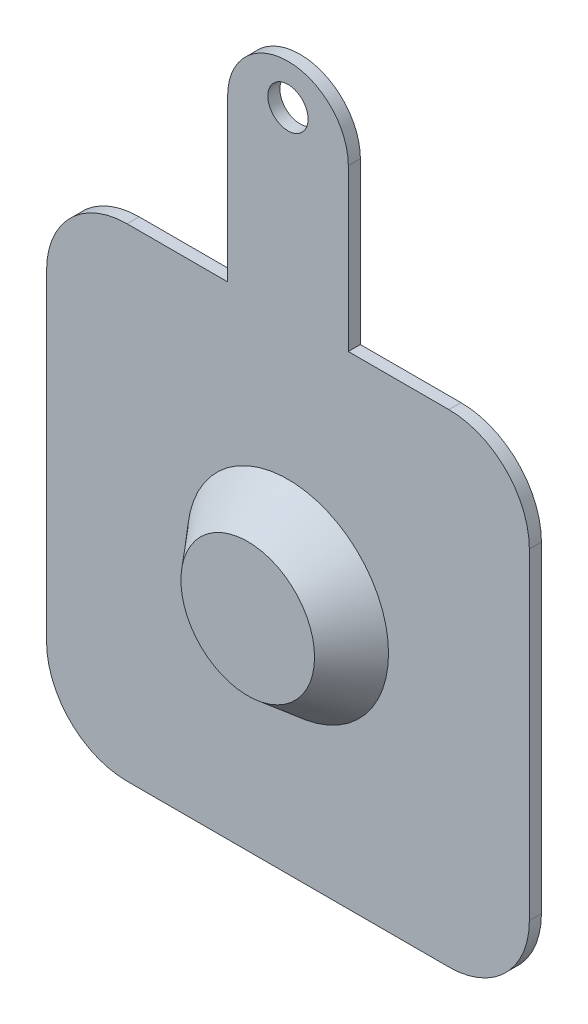
ISO-10303-21;
HEADER;
FILE_DESCRIPTION(('STEP AP214'),'2;1');
FILE_NAME('part.step','',(''),(''),'','','');
FILE_SCHEMA(('AUTOMOTIVE_DESIGN { 1 0 10303 214 1 1 1 1 }'));
ENDSEC;
DATA;
#1=APPLICATION_CONTEXT('core data for automotive mechanical design processes');
#2=APPLICATION_PROTOCOL_DEFINITION('international standard','automotive_design',2000,#1);
#3=PRODUCT_CONTEXT('',#1,'mechanical');
#4=PRODUCT('Part','Part','',(#3));
#5=PRODUCT_RELATED_PRODUCT_CATEGORY('part','',(#4));
#6=PRODUCT_DEFINITION_FORMATION('','',#4);
#7=PRODUCT_DEFINITION_CONTEXT('part definition',#1,'design');
#8=PRODUCT_DEFINITION('design','',#6,#7);
#9=PRODUCT_DEFINITION_SHAPE('','',#8);
#10=(LENGTH_UNIT() NAMED_UNIT(*) SI_UNIT(.MILLI.,.METRE.));
#11=(NAMED_UNIT(*) PLANE_ANGLE_UNIT() SI_UNIT($,.RADIAN.));
#12=(NAMED_UNIT(*) SI_UNIT($,.STERADIAN.) SOLID_ANGLE_UNIT());
#13=UNCERTAINTY_MEASURE_WITH_UNIT(LENGTH_MEASURE(1.E-05),#10,'distance_accuracy_value','');
#14=(GEOMETRIC_REPRESENTATION_CONTEXT(3) GLOBAL_UNCERTAINTY_ASSIGNED_CONTEXT((#13)) GLOBAL_UNIT_ASSIGNED_CONTEXT((#10,
#11,#12)) REPRESENTATION_CONTEXT('',''));
#15=CARTESIAN_POINT('',(0.,0.,0.));
#16=DIRECTION('',(0.,0.,1.));
#17=DIRECTION('',(1.,0.,0.));
#18=AXIS2_PLACEMENT_3D('',#15,#16,#17);
#19=CARTESIAN_POINT('',(0.,0.,0.3));
#20=DIRECTION('',(-1.,0.,0.));
#21=DIRECTION('',(0.,-1.,0.));
#22=AXIS2_PLACEMENT_3D('',#19,#20,#21);
#23=PLANE('',#22);
#24=DIRECTION('',(0.,1.,0.));
#25=VECTOR('',#24,1.);
#26=CARTESIAN_POINT('',(0.,0.,0.3));
#27=LINE('',#26,#25);
#28=CARTESIAN_POINT('',(0.,2.,0.3));
#29=VERTEX_POINT('',#28);
#30=CARTESIAN_POINT('',(0.,10.,0.3));
#31=VERTEX_POINT('',#30);
#32=EDGE_CURVE('E139',#29,#31,#27,.T.);
#33=ORIENTED_EDGE('',*,*,#32,.F.);
#34=DIRECTION('',(0.,0.,-1.));
#35=VECTOR('',#34,1.);
#36=CARTESIAN_POINT('',(0.,2.,0.3));
#37=LINE('',#36,#35);
#38=CARTESIAN_POINT('',(0.,2.,0.));
#39=VERTEX_POINT('',#38);
#40=EDGE_CURVE('E194',#29,#39,#37,.T.);
#41=ORIENTED_EDGE('',*,*,#40,.T.);
#42=DIRECTION('',(0.,1.,0.));
#43=VECTOR('',#42,1.);
#44=CARTESIAN_POINT('',(0.,0.,0.));
#45=LINE('',#44,#43);
#46=CARTESIAN_POINT('',(0.,10.,0.));
#47=VERTEX_POINT('',#46);
#48=EDGE_CURVE('E168',#39,#47,#45,.T.);
#49=ORIENTED_EDGE('',*,*,#48,.T.);
#50=DIRECTION('',(0.,0.,-1.));
#51=VECTOR('',#50,1.);
#52=CARTESIAN_POINT('',(0.,10.,0.3));
#53=LINE('',#52,#51);
#54=EDGE_CURVE('E148',#47,#31,#53,.F.);
#55=ORIENTED_EDGE('',*,*,#54,.T.);
#56=EDGE_LOOP('',(#33,#41,#49,#55));
#57=FACE_BOUND('',#56,.T.);
#58=ADVANCED_FACE('F35',(#57),#23,.F.);
#59=CARTESIAN_POINT('',(0.,12.,0.3));
#60=DIRECTION('',(0.,-1.,0.));
#61=DIRECTION('',(1.,0.,0.));
#62=AXIS2_PLACEMENT_3D('',#59,#60,#61);
#63=PLANE('',#62);
#64=DIRECTION('',(-1.,0.,0.));
#65=VECTOR('',#64,1.);
#66=CARTESIAN_POINT('',(0.,12.,0.3));
#67=LINE('',#66,#65);
#68=CARTESIAN_POINT('',(-2.,12.,0.3));
#69=VERTEX_POINT('',#68);
#70=CARTESIAN_POINT('',(-4.5,12.,0.3));
#71=VERTEX_POINT('',#70);
#72=EDGE_CURVE('E126',#69,#71,#67,.T.);
#73=ORIENTED_EDGE('',*,*,#72,.F.);
#74=DIRECTION('',(0.,0.,-1.));
#75=VECTOR('',#74,1.);
#76=CARTESIAN_POINT('',(-2.,12.,0.3));
#77=LINE('',#76,#75);
#78=CARTESIAN_POINT('',(-2.,12.,0.));
#79=VERTEX_POINT('',#78);
#80=EDGE_CURVE('E44',#69,#79,#77,.T.);
#81=ORIENTED_EDGE('',*,*,#80,.T.);
#82=DIRECTION('',(-1.,0.,0.));
#83=VECTOR('',#82,1.);
#84=CARTESIAN_POINT('',(0.,12.,0.));
#85=LINE('',#84,#83);
#86=CARTESIAN_POINT('',(-4.5,12.,0.));
#87=VERTEX_POINT('',#86);
#88=EDGE_CURVE('E145',#79,#87,#85,.T.);
#89=ORIENTED_EDGE('',*,*,#88,.T.);
#90=DIRECTION('',(0.,0.,-1.));
#91=VECTOR('',#90,1.);
#92=CARTESIAN_POINT('',(-4.5,12.,0.3));
#93=LINE('',#92,#91);
#94=EDGE_CURVE('E142',#71,#87,#93,.T.);
#95=ORIENTED_EDGE('',*,*,#94,.F.);
#96=EDGE_LOOP('',(#73,#81,#89,#95));
#97=FACE_BOUND('',#96,.T.);
#98=ADVANCED_FACE('F143',(#97),#63,.F.);
#99=CARTESIAN_POINT('',(-4.5,12.,0.3));
#100=DIRECTION('',(-1.,0.,0.));
#101=DIRECTION('',(0.,0.,1.));
#102=AXIS2_PLACEMENT_3D('',#99,#100,#101);
#103=PLANE('',#102);
#104=DIRECTION('',(0.,1.,0.));
#105=VECTOR('',#104,1.);
#106=CARTESIAN_POINT('',(-4.5,12.,0.));
#107=LINE('',#106,#105);
#108=CARTESIAN_POINT('',(-4.5,16.,0.));
#109=VERTEX_POINT('',#108);
#110=EDGE_CURVE('E173',#87,#109,#107,.T.);
#111=ORIENTED_EDGE('',*,*,#110,.T.);
#112=DIRECTION('',(0.,0.,-1.));
#113=VECTOR('',#112,1.);
#114=CARTESIAN_POINT('',(-4.5,16.,0.3));
#115=LINE('',#114,#113);
#116=CARTESIAN_POINT('',(-4.5,16.,0.3));
#117=VERTEX_POINT('',#116);
#118=EDGE_CURVE('E149',#117,#109,#115,.T.);
#119=ORIENTED_EDGE('',*,*,#118,.F.);
#120=DIRECTION('',(0.,1.,0.));
#121=VECTOR('',#120,1.);
#122=CARTESIAN_POINT('',(-4.5,12.,0.3));
#123=LINE('',#122,#121);
#124=EDGE_CURVE('E131',#71,#117,#123,.T.);
#125=ORIENTED_EDGE('',*,*,#124,.F.);
#126=ORIENTED_EDGE('',*,*,#94,.T.);
#127=EDGE_LOOP('',(#111,#119,#125,#126));
#128=FACE_BOUND('',#127,.T.);
#129=ADVANCED_FACE('F151',(#128),#103,.F.);
#130=CARTESIAN_POINT('',(-6.,16.,0.3));
#131=DIRECTION('',(0.,0.,-1.));
#132=DIRECTION('',(-1.,0.,0.));
#133=AXIS2_PLACEMENT_3D('',#130,#131,#132);
#134=CYLINDRICAL_SURFACE('',#133,1.5);
#135=CARTESIAN_POINT('',(-6.,16.,0.));
#136=DIRECTION('',(0.,0.,1.));
#137=DIRECTION('',(1.,0.,0.));
#138=AXIS2_PLACEMENT_3D('',#135,#136,#137);
#139=CIRCLE('',#138,1.5);
#140=CARTESIAN_POINT('',(-7.5,16.,0.));
#141=VERTEX_POINT('',#140);
#142=EDGE_CURVE('E175',#109,#141,#139,.T.);
#143=ORIENTED_EDGE('',*,*,#142,.T.);
#144=DIRECTION('',(0.,0.,-1.));
#145=VECTOR('',#144,1.);
#146=CARTESIAN_POINT('',(-7.5,16.,0.3));
#147=LINE('',#146,#145);
#148=CARTESIAN_POINT('',(-7.5,16.,0.3));
#149=VERTEX_POINT('',#148);
#150=EDGE_CURVE('E189',#149,#141,#147,.T.);
#151=ORIENTED_EDGE('',*,*,#150,.F.);
#152=CARTESIAN_POINT('',(-6.,16.,0.3));
#153=DIRECTION('',(0.,0.,1.));
#154=DIRECTION('',(1.,0.,0.));
#155=AXIS2_PLACEMENT_3D('',#152,#153,#154);
#156=CIRCLE('',#155,1.5);
#157=EDGE_CURVE('E154',#117,#149,#156,.T.);
#158=ORIENTED_EDGE('',*,*,#157,.F.);
#159=ORIENTED_EDGE('',*,*,#118,.T.);
#160=EDGE_LOOP('',(#143,#151,#158,#159));
#161=FACE_BOUND('',#160,.T.);
#162=ADVANCED_FACE('F228',(#161),#134,.T.);
#163=CARTESIAN_POINT('',(-7.5,12.,0.3));
#164=DIRECTION('',(1.,0.,0.));
#165=DIRECTION('',(0.,0.,-1.));
#166=AXIS2_PLACEMENT_3D('',#163,#164,#165);
#167=PLANE('',#166);
#168=DIRECTION('',(0.,-1.,0.));
#169=VECTOR('',#168,1.);
#170=CARTESIAN_POINT('',(-7.5,12.,0.));
#171=LINE('',#170,#169);
#172=CARTESIAN_POINT('',(-7.5,12.,0.));
#173=VERTEX_POINT('',#172);
#174=EDGE_CURVE('E177',#141,#173,#171,.T.);
#175=ORIENTED_EDGE('',*,*,#174,.T.);
#176=DIRECTION('',(0.,0.,-1.));
#177=VECTOR('',#176,1.);
#178=CARTESIAN_POINT('',(-7.5,12.,0.3));
#179=LINE('',#178,#177);
#180=CARTESIAN_POINT('',(-7.5,12.,0.3));
#181=VERTEX_POINT('',#180);
#182=EDGE_CURVE('E167',#181,#173,#179,.T.);
#183=ORIENTED_EDGE('',*,*,#182,.F.);
#184=DIRECTION('',(0.,-1.,0.));
#185=VECTOR('',#184,1.);
#186=CARTESIAN_POINT('',(-7.5,12.,0.3));
#187=LINE('',#186,#185);
#188=EDGE_CURVE('E156',#149,#181,#187,.T.);
#189=ORIENTED_EDGE('',*,*,#188,.F.);
#190=ORIENTED_EDGE('',*,*,#150,.T.);
#191=EDGE_LOOP('',(#175,#183,#189,#190));
#192=FACE_BOUND('',#191,.T.);
#193=ADVANCED_FACE('F234',(#192),#167,.F.);
#194=CARTESIAN_POINT('',(-7.5,12.,0.3));
#195=DIRECTION('',(0.,-1.,0.));
#196=DIRECTION('',(0.,0.,-1.));
#197=AXIS2_PLACEMENT_3D('',#194,#195,#196);
#198=PLANE('',#197);
#199=DIRECTION('',(-1.,0.,0.));
#200=VECTOR('',#199,1.);
#201=CARTESIAN_POINT('',(-7.5,12.,0.));
#202=LINE('',#201,#200);
#203=CARTESIAN_POINT('',(-10.,12.,0.));
#204=VERTEX_POINT('',#203);
#205=EDGE_CURVE('E179',#173,#204,#202,.T.);
#206=ORIENTED_EDGE('',*,*,#205,.T.);
#207=DIRECTION('',(0.,0.,-1.));
#208=VECTOR('',#207,1.);
#209=CARTESIAN_POINT('',(-10.,12.,0.3));
#210=LINE('',#209,#208);
#211=CARTESIAN_POINT('',(-10.,12.,0.3));
#212=VERTEX_POINT('',#211);
#213=EDGE_CURVE('E220',#204,#212,#210,.F.);
#214=ORIENTED_EDGE('',*,*,#213,.T.);
#215=DIRECTION('',(-1.,0.,0.));
#216=VECTOR('',#215,1.);
#217=CARTESIAN_POINT('',(-7.5,12.,0.3));
#218=LINE('',#217,#216);
#219=EDGE_CURVE('E161',#181,#212,#218,.T.);
#220=ORIENTED_EDGE('',*,*,#219,.F.);
#221=ORIENTED_EDGE('',*,*,#182,.T.);
#222=EDGE_LOOP('',(#206,#214,#220,#221));
#223=FACE_BOUND('',#222,.T.);
#224=ADVANCED_FACE('F237',(#223),#198,.F.);
#225=CARTESIAN_POINT('',(-12.,0.,0.3));
#226=DIRECTION('',(1.,0.,0.));
#227=DIRECTION('',(0.,0.,-1.));
#228=AXIS2_PLACEMENT_3D('',#225,#226,#227);
#229=PLANE('',#228);
#230=DIRECTION('',(0.,-1.,0.));
#231=VECTOR('',#230,1.);
#232=CARTESIAN_POINT('',(-12.,0.,0.));
#233=LINE('',#232,#231);
#234=CARTESIAN_POINT('',(-12.,10.,0.));
#235=VERTEX_POINT('',#234);
#236=CARTESIAN_POINT('',(-12.,2.,0.));
#237=VERTEX_POINT('',#236);
#238=EDGE_CURVE('E182',#235,#237,#233,.T.);
#239=ORIENTED_EDGE('',*,*,#238,.T.);
#240=DIRECTION('',(0.,0.,-1.));
#241=VECTOR('',#240,1.);
#242=CARTESIAN_POINT('',(-12.,2.,0.3));
#243=LINE('',#242,#241);
#244=CARTESIAN_POINT('',(-12.,2.,0.3));
#245=VERTEX_POINT('',#244);
#246=EDGE_CURVE('E52',#237,#245,#243,.F.);
#247=ORIENTED_EDGE('',*,*,#246,.T.);
#248=DIRECTION('',(0.,-1.,0.));
#249=VECTOR('',#248,1.);
#250=CARTESIAN_POINT('',(-12.,0.,0.3));
#251=LINE('',#250,#249);
#252=CARTESIAN_POINT('',(-12.,10.,0.3));
#253=VERTEX_POINT('',#252);
#254=EDGE_CURVE('E163',#253,#245,#251,.T.);
#255=ORIENTED_EDGE('',*,*,#254,.F.);
#256=DIRECTION('',(0.,0.,-1.));
#257=VECTOR('',#256,1.);
#258=CARTESIAN_POINT('',(-12.,10.,0.3));
#259=LINE('',#258,#257);
#260=EDGE_CURVE('E216',#253,#235,#259,.T.);
#261=ORIENTED_EDGE('',*,*,#260,.T.);
#262=EDGE_LOOP('',(#239,#247,#255,#261));
#263=FACE_BOUND('',#262,.T.);
#264=ADVANCED_FACE('F243',(#263),#229,.F.);
#265=CARTESIAN_POINT('',(0.,0.,0.3));
#266=DIRECTION('',(0.,1.,0.));
#267=DIRECTION('',(0.,0.,1.));
#268=AXIS2_PLACEMENT_3D('',#265,#266,#267);
#269=PLANE('',#268);
#270=DIRECTION('',(1.,0.,0.));
#271=VECTOR('',#270,1.);
#272=CARTESIAN_POINT('',(0.,0.,0.));
#273=LINE('',#272,#271);
#274=CARTESIAN_POINT('',(-10.,0.,0.));
#275=VERTEX_POINT('',#274);
#276=CARTESIAN_POINT('',(-2.,0.,0.));
#277=VERTEX_POINT('',#276);
#278=EDGE_CURVE('E184',#275,#277,#273,.T.);
#279=ORIENTED_EDGE('',*,*,#278,.T.);
#280=DIRECTION('',(0.,0.,-1.));
#281=VECTOR('',#280,1.);
#282=CARTESIAN_POINT('',(-2.,0.,0.3));
#283=LINE('',#282,#281);
#284=CARTESIAN_POINT('',(-2.,0.,0.3));
#285=VERTEX_POINT('',#284);
#286=EDGE_CURVE('E208',#277,#285,#283,.F.);
#287=ORIENTED_EDGE('',*,*,#286,.T.);
#288=DIRECTION('',(1.,0.,0.));
#289=VECTOR('',#288,1.);
#290=CARTESIAN_POINT('',(0.,0.,0.3));
#291=LINE('',#290,#289);
#292=CARTESIAN_POINT('',(-10.,0.,0.3));
#293=VERTEX_POINT('',#292);
#294=EDGE_CURVE('E165',#293,#285,#291,.T.);
#295=ORIENTED_EDGE('',*,*,#294,.F.);
#296=DIRECTION('',(0.,0.,-1.));
#297=VECTOR('',#296,1.);
#298=CARTESIAN_POINT('',(-10.,0.,0.3));
#299=LINE('',#298,#297);
#300=EDGE_CURVE('E205',#293,#275,#299,.T.);
#301=ORIENTED_EDGE('',*,*,#300,.T.);
#302=EDGE_LOOP('',(#279,#287,#295,#301));
#303=FACE_BOUND('',#302,.T.);
#304=ADVANCED_FACE('F251',(#303),#269,.F.);
#305=CARTESIAN_POINT('',(-6.,16.,0.3));
#306=DIRECTION('',(0.,0.,1.));
#307=DIRECTION('',(1.,0.,0.));
#308=AXIS2_PLACEMENT_3D('',#305,#306,#307);
#309=PLANE('',#308);
#310=CARTESIAN_POINT('',(-6.,16.5,0.3));
#311=DIRECTION('',(0.,0.,1.));
#312=DIRECTION('',(1.,0.,0.));
#313=AXIS2_PLACEMENT_3D('',#310,#311,#312);
#314=CIRCLE('',#313,0.500000000000001);
#315=CARTESIAN_POINT('',(-5.5,16.5,0.3));
#316=VERTEX_POINT('',#315);
#317=EDGE_CURVE('E263',#316,#316,#314,.T.);
#318=ORIENTED_EDGE('',*,*,#317,.F.);
#319=EDGE_LOOP('',(#318));
#320=FACE_BOUND('',#319,.T.);
#321=CARTESIAN_POINT('',(-6.,6.,0.3));
#322=DIRECTION('',(0.,0.,1.));
#323=DIRECTION('',(1.,0.,0.));
#324=AXIS2_PLACEMENT_3D('',#321,#322,#323);
#325=CIRCLE('',#324,2.5);
#326=CARTESIAN_POINT('',(-3.5,6.,0.3));
#327=VERTEX_POINT('',#326);
#328=EDGE_CURVE('E11',#327,#327,#325,.T.);
#329=ORIENTED_EDGE('',*,*,#328,.F.);
#330=EDGE_LOOP('',(#329));
#331=FACE_BOUND('',#330,.T.);
#332=ORIENTED_EDGE('',*,*,#294,.T.);
#333=CARTESIAN_POINT('',(-2.,2.,0.3));
#334=DIRECTION('',(0.,0.,1.));
#335=DIRECTION('',(1.,0.,0.));
#336=AXIS2_PLACEMENT_3D('',#333,#334,#335);
#337=CIRCLE('',#336,2.);
#338=EDGE_CURVE('E214',#285,#29,#337,.T.);
#339=ORIENTED_EDGE('',*,*,#338,.T.);
#340=ORIENTED_EDGE('',*,*,#32,.T.);
#341=CARTESIAN_POINT('',(-2.,10.,0.3));
#342=DIRECTION('',(0.,0.,1.));
#343=DIRECTION('',(1.,0.,0.));
#344=AXIS2_PLACEMENT_3D('',#341,#342,#343);
#345=CIRCLE('',#344,2.);
#346=EDGE_CURVE('E135',#31,#69,#345,.T.);
#347=ORIENTED_EDGE('',*,*,#346,.T.);
#348=ORIENTED_EDGE('',*,*,#72,.T.);
#349=ORIENTED_EDGE('',*,*,#124,.T.);
#350=ORIENTED_EDGE('',*,*,#157,.T.);
#351=ORIENTED_EDGE('',*,*,#188,.T.);
#352=ORIENTED_EDGE('',*,*,#219,.T.);
#353=CARTESIAN_POINT('',(-10.,10.,0.3));
#354=DIRECTION('',(0.,0.,1.));
#355=DIRECTION('',(1.,0.,0.));
#356=AXIS2_PLACEMENT_3D('',#353,#354,#355);
#357=CIRCLE('',#356,2.);
#358=EDGE_CURVE('E59',#212,#253,#357,.T.);
#359=ORIENTED_EDGE('',*,*,#358,.T.);
#360=ORIENTED_EDGE('',*,*,#254,.T.);
#361=CARTESIAN_POINT('',(-10.,2.,0.3));
#362=DIRECTION('',(0.,0.,1.));
#363=DIRECTION('',(1.,0.,0.));
#364=AXIS2_PLACEMENT_3D('',#361,#362,#363);
#365=CIRCLE('',#364,2.);
#366=EDGE_CURVE('E212',#245,#293,#365,.T.);
#367=ORIENTED_EDGE('',*,*,#366,.T.);
#368=EDGE_LOOP('',(#332,#339,#340,#347,#348,#349,#350,#351,#352,#359,#360,#367));
#369=FACE_BOUND('',#368,.T.);
#370=ADVANCED_FACE('F129',(#320,#331,#369),#309,.T.);
#371=CARTESIAN_POINT('',(-6.,16.,0.));
#372=DIRECTION('',(0.,0.,1.));
#373=DIRECTION('',(1.,0.,0.));
#374=AXIS2_PLACEMENT_3D('',#371,#372,#373);
#375=PLANE('',#374);
#376=CARTESIAN_POINT('',(-6.,16.5,0.));
#377=DIRECTION('',(0.,0.,1.));
#378=DIRECTION('',(1.,0.,0.));
#379=AXIS2_PLACEMENT_3D('',#376,#377,#378);
#380=CIRCLE('',#379,0.500000000000001);
#381=CARTESIAN_POINT('',(-5.5,16.5,0.));
#382=VERTEX_POINT('',#381);
#383=EDGE_CURVE('E39',#382,#382,#380,.T.);
#384=ORIENTED_EDGE('',*,*,#383,.T.);
#385=EDGE_LOOP('',(#384));
#386=FACE_BOUND('',#385,.T.);
#387=ORIENTED_EDGE('',*,*,#48,.F.);
#388=CARTESIAN_POINT('',(-2.,2.,0.));
#389=DIRECTION('',(0.,0.,1.));
#390=DIRECTION('',(1.,0.,0.));
#391=AXIS2_PLACEMENT_3D('',#388,#389,#390);
#392=CIRCLE('',#391,2.);
#393=EDGE_CURVE('E203',#39,#277,#392,.F.);
#394=ORIENTED_EDGE('',*,*,#393,.T.);
#395=ORIENTED_EDGE('',*,*,#278,.F.);
#396=CARTESIAN_POINT('',(-10.,2.,0.));
#397=DIRECTION('',(0.,0.,1.));
#398=DIRECTION('',(1.,0.,0.));
#399=AXIS2_PLACEMENT_3D('',#396,#397,#398);
#400=CIRCLE('',#399,2.);
#401=EDGE_CURVE('E201',#275,#237,#400,.F.);
#402=ORIENTED_EDGE('',*,*,#401,.T.);
#403=ORIENTED_EDGE('',*,*,#238,.F.);
#404=CARTESIAN_POINT('',(-10.,10.,0.));
#405=DIRECTION('',(0.,0.,1.));
#406=DIRECTION('',(1.,0.,0.));
#407=AXIS2_PLACEMENT_3D('',#404,#405,#406);
#408=CIRCLE('',#407,2.);
#409=EDGE_CURVE('E199',#235,#204,#408,.F.);
#410=ORIENTED_EDGE('',*,*,#409,.T.);
#411=ORIENTED_EDGE('',*,*,#205,.F.);
#412=ORIENTED_EDGE('',*,*,#174,.F.);
#413=ORIENTED_EDGE('',*,*,#142,.F.);
#414=ORIENTED_EDGE('',*,*,#110,.F.);
#415=ORIENTED_EDGE('',*,*,#88,.F.);
#416=CARTESIAN_POINT('',(-2.,10.,0.));
#417=DIRECTION('',(0.,0.,1.));
#418=DIRECTION('',(1.,0.,0.));
#419=AXIS2_PLACEMENT_3D('',#416,#417,#418);
#420=CIRCLE('',#419,2.);
#421=EDGE_CURVE('E197',#79,#47,#420,.F.);
#422=ORIENTED_EDGE('',*,*,#421,.T.);
#423=EDGE_LOOP('',(#387,#394,#395,#402,#403,#410,#411,#412,#413,#414,#415,#422));
#424=FACE_BOUND('',#423,.T.);
#425=ADVANCED_FACE('F224',(#386,#424),#375,.F.);
#426=CARTESIAN_POINT('',(-2.,2.,0.3));
#427=DIRECTION('',(0.,0.,-1.));
#428=DIRECTION('',(-1.,0.,0.));
#429=AXIS2_PLACEMENT_3D('',#426,#427,#428);
#430=CYLINDRICAL_SURFACE('',#429,2.);
#431=ORIENTED_EDGE('',*,*,#338,.F.);
#432=ORIENTED_EDGE('',*,*,#286,.F.);
#433=ORIENTED_EDGE('',*,*,#393,.F.);
#434=ORIENTED_EDGE('',*,*,#40,.F.);
#435=EDGE_LOOP('',(#431,#432,#433,#434));
#436=FACE_BOUND('',#435,.T.);
#437=ADVANCED_FACE('F257',(#436),#430,.T.);
#438=CARTESIAN_POINT('',(-10.,2.,0.3));
#439=DIRECTION('',(0.,0.,-1.));
#440=DIRECTION('',(-1.,0.,0.));
#441=AXIS2_PLACEMENT_3D('',#438,#439,#440);
#442=CYLINDRICAL_SURFACE('',#441,2.);
#443=ORIENTED_EDGE('',*,*,#366,.F.);
#444=ORIENTED_EDGE('',*,*,#246,.F.);
#445=ORIENTED_EDGE('',*,*,#401,.F.);
#446=ORIENTED_EDGE('',*,*,#300,.F.);
#447=EDGE_LOOP('',(#443,#444,#445,#446));
#448=FACE_BOUND('',#447,.T.);
#449=ADVANCED_FACE('F248',(#448),#442,.T.);
#450=CARTESIAN_POINT('',(-10.,10.,0.3));
#451=DIRECTION('',(0.,0.,-1.));
#452=DIRECTION('',(-1.,0.,0.));
#453=AXIS2_PLACEMENT_3D('',#450,#451,#452);
#454=CYLINDRICAL_SURFACE('',#453,2.);
#455=ORIENTED_EDGE('',*,*,#358,.F.);
#456=ORIENTED_EDGE('',*,*,#213,.F.);
#457=ORIENTED_EDGE('',*,*,#409,.F.);
#458=ORIENTED_EDGE('',*,*,#260,.F.);
#459=EDGE_LOOP('',(#455,#456,#457,#458));
#460=FACE_BOUND('',#459,.T.);
#461=ADVANCED_FACE('F240',(#460),#454,.T.);
#462=CARTESIAN_POINT('',(-2.,10.,0.3));
#463=DIRECTION('',(0.,0.,-1.));
#464=DIRECTION('',(-1.,0.,0.));
#465=AXIS2_PLACEMENT_3D('',#462,#463,#464);
#466=CYLINDRICAL_SURFACE('',#465,2.);
#467=ORIENTED_EDGE('',*,*,#346,.F.);
#468=ORIENTED_EDGE('',*,*,#54,.F.);
#469=ORIENTED_EDGE('',*,*,#421,.F.);
#470=ORIENTED_EDGE('',*,*,#80,.F.);
#471=EDGE_LOOP('',(#467,#468,#469,#470));
#472=FACE_BOUND('',#471,.T.);
#473=ADVANCED_FACE('F37',(#472),#466,.T.);
#474=CARTESIAN_POINT('',(-6.,6.,0.3));
#475=DIRECTION('',(0.,0.,-1.));
#476=DIRECTION('',(1.,0.,0.));
#477=AXIS2_PLACEMENT_3D('',#474,#475,#476);
#478=CONICAL_SURFACE('',#477,2.5,0.698131700797732);
#479=CARTESIAN_POINT('',(-6.,6.,1.3));
#480=DIRECTION('',(0.,0.,1.));
#481=DIRECTION('',(1.,0.,0.));
#482=AXIS2_PLACEMENT_3D('',#479,#480,#481);
#483=CIRCLE('',#482,1.66090036882272);
#484=CARTESIAN_POINT('',(-4.33909963117728,6.,1.3));
#485=VERTEX_POINT('',#484);
#486=EDGE_CURVE('E171',#485,#485,#483,.T.);
#487=ORIENTED_EDGE('',*,*,#486,.F.);
#488=EDGE_LOOP('',(#487));
#489=FACE_BOUND('',#488,.T.);
#490=ORIENTED_EDGE('',*,*,#328,.T.);
#491=EDGE_LOOP('',(#490));
#492=FACE_BOUND('',#491,.T.);
#493=ADVANCED_FACE('F278',(#489,#492),#478,.T.);
#494=CARTESIAN_POINT('',(-6.,6.,1.3));
#495=DIRECTION('',(0.,0.,1.));
#496=DIRECTION('',(1.,0.,0.));
#497=AXIS2_PLACEMENT_3D('',#494,#495,#496);
#498=PLANE('',#497);
#499=ORIENTED_EDGE('',*,*,#486,.T.);
#500=EDGE_LOOP('',(#499));
#501=FACE_BOUND('',#500,.T.);
#502=ADVANCED_FACE('F273',(#501),#498,.T.);
#503=CARTESIAN_POINT('',(-6.,16.5,-0.7));
#504=DIRECTION('',(0.,0.,1.));
#505=DIRECTION('',(1.,0.,0.));
#506=AXIS2_PLACEMENT_3D('',#503,#504,#505);
#507=CYLINDRICAL_SURFACE('',#506,0.500000000000001);
#508=ORIENTED_EDGE('',*,*,#317,.T.);
#509=EDGE_LOOP('',(#508));
#510=FACE_BOUND('',#509,.T.);
#511=ORIENTED_EDGE('',*,*,#383,.F.);
#512=EDGE_LOOP('',(#511));
#513=FACE_BOUND('',#512,.T.);
#514=ADVANCED_FACE('F271',(#510,#513),#507,.F.);
#515=CLOSED_SHELL('',(#58,#98,#129,#162,#193,#224,#264,#304,#370,#425,#437,#449,#461,#473,#493,
#502,#514));
#516=MANIFOLD_SOLID_BREP('B2',#515);
#517=ADVANCED_BREP_SHAPE_REPRESENTATION('',(#18,#516),#14);
#518=SHAPE_DEFINITION_REPRESENTATION(#9,#517);
ENDSEC;
END-ISO-10303-21;
